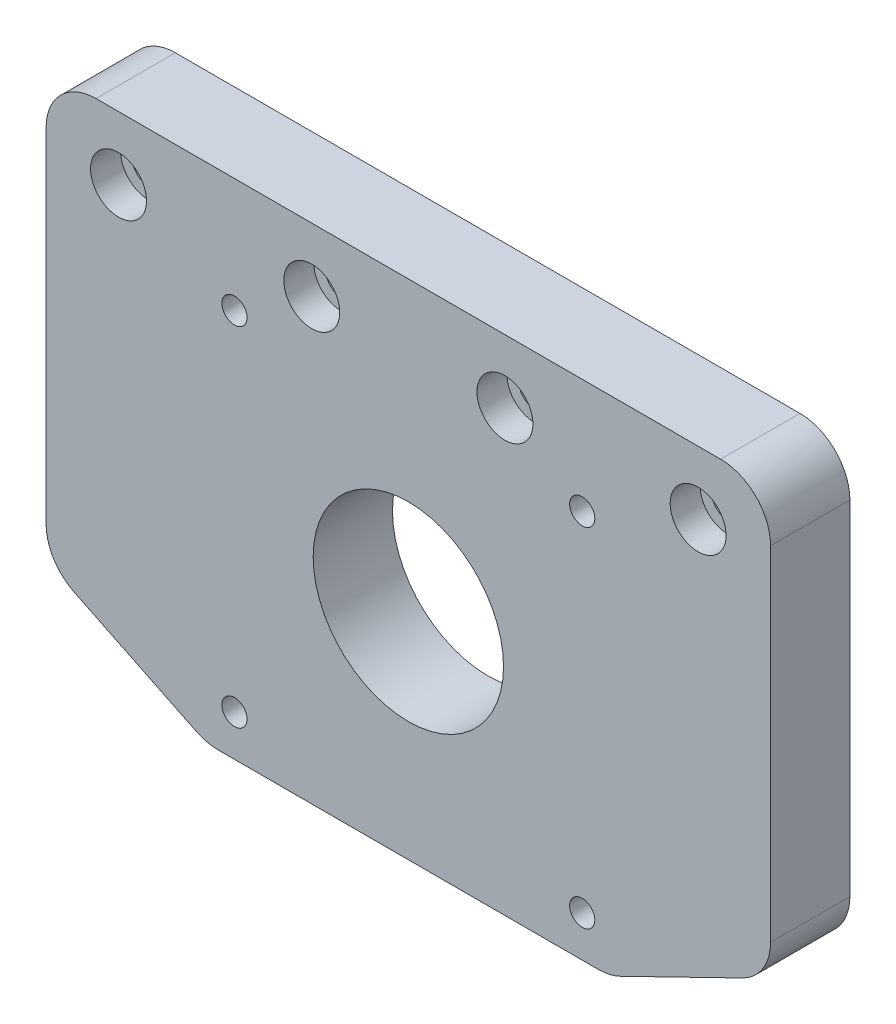
ISO-10303-21;
HEADER;
FILE_DESCRIPTION(('STEP AP214'),'2;1');
FILE_NAME('part.step','',(''),(''),'','','');
FILE_SCHEMA(('AUTOMOTIVE_DESIGN { 1 0 10303 214 1 1 1 1 }'));
ENDSEC;
DATA;
#1=APPLICATION_CONTEXT('core data for automotive mechanical design processes');
#2=APPLICATION_PROTOCOL_DEFINITION('international standard','automotive_design',2000,#1);
#3=PRODUCT_CONTEXT('',#1,'mechanical');
#4=PRODUCT('Part','Part','',(#3));
#5=PRODUCT_RELATED_PRODUCT_CATEGORY('part','',(#4));
#6=PRODUCT_DEFINITION_FORMATION('','',#4);
#7=PRODUCT_DEFINITION_CONTEXT('part definition',#1,'design');
#8=PRODUCT_DEFINITION('design','',#6,#7);
#9=PRODUCT_DEFINITION_SHAPE('','',#8);
#10=(LENGTH_UNIT() NAMED_UNIT(*) SI_UNIT(.MILLI.,.METRE.));
#11=(NAMED_UNIT(*) PLANE_ANGLE_UNIT() SI_UNIT($,.RADIAN.));
#12=(NAMED_UNIT(*) SI_UNIT($,.STERADIAN.) SOLID_ANGLE_UNIT());
#13=UNCERTAINTY_MEASURE_WITH_UNIT(LENGTH_MEASURE(1.E-05),#10,'distance_accuracy_value','');
#14=(GEOMETRIC_REPRESENTATION_CONTEXT(3) GLOBAL_UNCERTAINTY_ASSIGNED_CONTEXT((#13)) GLOBAL_UNIT_ASSIGNED_CONTEXT((#10,
#11,#12)) REPRESENTATION_CONTEXT('',''));
#15=CARTESIAN_POINT('',(0.,0.,0.));
#16=DIRECTION('',(0.,0.,1.));
#17=DIRECTION('',(1.,0.,0.));
#18=AXIS2_PLACEMENT_3D('',#15,#16,#17);
#19=CARTESIAN_POINT('',(-221.389376145797,34.3266028726113,15.875));
#20=DIRECTION('',(0.,0.,1.));
#21=DIRECTION('',(1.,0.,0.));
#22=AXIS2_PLACEMENT_3D('',#19,#20,#21);
#23=PLANE('',#22);
#24=CARTESIAN_POINT('',(-221.389376145797,26.9851028726113,15.875));
#25=DIRECTION('',(0.,0.,-1.));
#26=DIRECTION('',(-1.,0.,0.));
#27=AXIS2_PLACEMENT_3D('',#24,#25,#26);
#28=CIRCLE('',#27,19.05);
#29=CARTESIAN_POINT('',(-202.339376145797,26.9851028726113,15.875));
#30=VERTEX_POINT('',#29);
#31=EDGE_CURVE('E425',#30,#30,#28,.T.);
#32=ORIENTED_EDGE('',*,*,#31,.T.);
#33=EDGE_LOOP('',(#32));
#34=FACE_BOUND('',#33,.T.);
#35=CARTESIAN_POINT('',(-256.189376145797,-7.81489712738868,15.875));
#36=DIRECTION('',(0.,0.,-1.));
#37=DIRECTION('',(1.,0.,0.));
#38=AXIS2_PLACEMENT_3D('',#35,#36,#37);
#39=CIRCLE('',#38,2.5175);
#40=CARTESIAN_POINT('',(-258.706876145797,-7.81489712738868,15.875));
#41=VERTEX_POINT('',#40);
#42=EDGE_CURVE('E416',#41,#41,#39,.T.);
#43=ORIENTED_EDGE('',*,*,#42,.T.);
#44=EDGE_LOOP('',(#43));
#45=FACE_BOUND('',#44,.T.);
#46=CARTESIAN_POINT('',(-186.589376145797,61.7851028726113,15.875));
#47=DIRECTION('',(0.,0.,-1.));
#48=DIRECTION('',(1.,0.,0.));
#49=AXIS2_PLACEMENT_3D('',#46,#47,#48);
#50=CIRCLE('',#49,2.5175);
#51=CARTESIAN_POINT('',(-189.106876145797,61.7851028726113,15.875));
#52=VERTEX_POINT('',#51);
#53=EDGE_CURVE('E207',#52,#52,#50,.T.);
#54=ORIENTED_EDGE('',*,*,#53,.T.);
#55=EDGE_LOOP('',(#54));
#56=FACE_BOUND('',#55,.T.);
#57=CARTESIAN_POINT('',(-256.189376145797,61.7851028726113,15.875));
#58=DIRECTION('',(0.,0.,-1.));
#59=DIRECTION('',(1.,0.,0.));
#60=AXIS2_PLACEMENT_3D('',#57,#58,#59);
#61=CIRCLE('',#60,2.5175);
#62=CARTESIAN_POINT('',(-258.706876145797,61.7851028726113,15.875));
#63=VERTEX_POINT('',#62);
#64=EDGE_CURVE('E202',#63,#63,#61,.T.);
#65=ORIENTED_EDGE('',*,*,#64,.T.);
#66=EDGE_LOOP('',(#65));
#67=FACE_BOUND('',#66,.T.);
#68=CARTESIAN_POINT('',(-186.589376145797,-7.81489712738868,15.875));
#69=DIRECTION('',(0.,0.,-1.));
#70=DIRECTION('',(1.,0.,0.));
#71=AXIS2_PLACEMENT_3D('',#68,#69,#70);
#72=CIRCLE('',#71,2.5175);
#73=CARTESIAN_POINT('',(-189.106876145797,-7.81489712738868,15.875));
#74=VERTEX_POINT('',#73);
#75=EDGE_CURVE('E219',#74,#74,#72,.T.);
#76=ORIENTED_EDGE('',*,*,#75,.T.);
#77=EDGE_LOOP('',(#76));
#78=FACE_BOUND('',#77,.T.);
#79=CARTESIAN_POINT('',(-163.389376145797,71.9681028726113,15.875));
#80=DIRECTION('',(0.,0.,-1.));
#81=DIRECTION('',(1.,0.,0.));
#82=AXIS2_PLACEMENT_3D('',#79,#80,#81);
#83=CIRCLE('',#82,5.6);
#84=CARTESIAN_POINT('',(-168.989376145797,71.9681028726113,15.875));
#85=VERTEX_POINT('',#84);
#86=EDGE_CURVE('E257',#85,#85,#83,.T.);
#87=ORIENTED_EDGE('',*,*,#86,.T.);
#88=EDGE_LOOP('',(#87));
#89=FACE_BOUND('',#88,.T.);
#90=CARTESIAN_POINT('',(-202.056042812464,71.9681028726113,15.875));
#91=DIRECTION('',(0.,0.,-1.));
#92=DIRECTION('',(1.,0.,0.));
#93=AXIS2_PLACEMENT_3D('',#90,#91,#92);
#94=CIRCLE('',#93,5.6);
#95=CARTESIAN_POINT('',(-207.656042812464,71.9681028726113,15.875));
#96=VERTEX_POINT('',#95);
#97=EDGE_CURVE('E240',#96,#96,#94,.T.);
#98=ORIENTED_EDGE('',*,*,#97,.T.);
#99=EDGE_LOOP('',(#98));
#100=FACE_BOUND('',#99,.T.);
#101=CARTESIAN_POINT('',(-240.72270947913,71.9681028726113,15.875));
#102=DIRECTION('',(0.,0.,-1.));
#103=DIRECTION('',(1.,0.,0.));
#104=AXIS2_PLACEMENT_3D('',#101,#102,#103);
#105=CIRCLE('',#104,5.6);
#106=CARTESIAN_POINT('',(-246.32270947913,71.9681028726113,15.875));
#107=VERTEX_POINT('',#106);
#108=EDGE_CURVE('E523',#107,#107,#105,.T.);
#109=ORIENTED_EDGE('',*,*,#108,.T.);
#110=EDGE_LOOP('',(#109));
#111=FACE_BOUND('',#110,.T.);
#112=CARTESIAN_POINT('',(-279.389376145797,71.9681028726113,15.875));
#113=DIRECTION('',(0.,0.,-1.));
#114=DIRECTION('',(1.,0.,0.));
#115=AXIS2_PLACEMENT_3D('',#112,#113,#114);
#116=CIRCLE('',#115,5.6);
#117=CARTESIAN_POINT('',(-284.989376145797,71.9681028726113,15.875));
#118=VERTEX_POINT('',#117);
#119=EDGE_CURVE('E527',#118,#118,#116,.T.);
#120=ORIENTED_EDGE('',*,*,#119,.T.);
#121=EDGE_LOOP('',(#120));
#122=FACE_BOUND('',#121,.T.);
#123=CARTESIAN_POINT('',(-283.889376145797,5.91685384979715,15.875));
#124=DIRECTION('',(0.,0.,-1.));
#125=DIRECTION('',(-0.848045906367809,-0.529922768611428,0.));
#126=AXIS2_PLACEMENT_3D('',#123,#124,#125);
#127=CIRCLE('',#126,10.);
#128=CARTESIAN_POINT('',(-288.273013331941,-3.0711228424432,15.875));
#129=VERTEX_POINT('',#128);
#130=CARTESIAN_POINT('',(-293.889376145797,5.91685384979715,15.875));
#131=VERTEX_POINT('',#130);
#132=EDGE_CURVE('E274',#129,#131,#127,.T.);
#133=ORIENTED_EDGE('',*,*,#132,.F.);
#134=DIRECTION('',(0.898797669224035,-0.438363718614397,0.));
#135=VECTOR('',#134,1.);
#136=CARTESIAN_POINT('',(-261.733786511246,-16.0148971273887,15.875));
#137=LINE('',#136,#135);
#138=CARTESIAN_POINT('',(-263.808785311534,-15.002873819629,15.875));
#139=VERTEX_POINT('',#138);
#140=EDGE_CURVE('E241',#129,#139,#137,.T.);
#141=ORIENTED_EDGE('',*,*,#140,.T.);
#142=CARTESIAN_POINT('',(-259.42514812539,-6.01489712738867,15.875));
#143=DIRECTION('',(0.,0.,-1.));
#144=DIRECTION('',(-0.224947027959879,-0.97437099434046,0.));
#145=AXIS2_PLACEMENT_3D('',#142,#143,#144);
#146=CIRCLE('',#145,10.);
#147=CARTESIAN_POINT('',(-259.42514812539,-16.0148971273887,15.875));
#148=VERTEX_POINT('',#147);
#149=EDGE_CURVE('E374',#148,#139,#146,.T.);
#150=ORIENTED_EDGE('',*,*,#149,.F.);
#151=DIRECTION('',(1.,0.,0.));
#152=VECTOR('',#151,1.);
#153=CARTESIAN_POINT('',(-220.113786511246,-16.0148971273887,15.875));
#154=LINE('',#153,#152);
#155=CARTESIAN_POINT('',(-183.353604166204,-16.0148971273887,15.875));
#156=VERTEX_POINT('',#155);
#157=EDGE_CURVE('E384',#148,#156,#154,.T.);
#158=ORIENTED_EDGE('',*,*,#157,.T.);
#159=CARTESIAN_POINT('',(-183.353604166204,-6.01489712738867,15.875));
#160=DIRECTION('',(0.,0.,-1.));
#161=DIRECTION('',(0.224947027959879,-0.97437099434046,0.));
#162=AXIS2_PLACEMENT_3D('',#159,#160,#161);
#163=CIRCLE('',#162,10.);
#164=CARTESIAN_POINT('',(-178.96996698006,-15.002873819629,15.875));
#165=VERTEX_POINT('',#164);
#166=EDGE_CURVE('E309',#165,#156,#163,.T.);
#167=ORIENTED_EDGE('',*,*,#166,.F.);
#168=DIRECTION('',(0.898797669224035,0.438363718614397,0.));
#169=VECTOR('',#168,1.);
#170=CARTESIAN_POINT('',(-181.044965780348,-16.0148971273887,15.875));
#171=LINE('',#170,#169);
#172=CARTESIAN_POINT('',(-154.505738959653,-3.0711228424432,15.875));
#173=VERTEX_POINT('',#172);
#174=EDGE_CURVE('E394',#165,#173,#171,.T.);
#175=ORIENTED_EDGE('',*,*,#174,.T.);
#176=CARTESIAN_POINT('',(-158.889376145797,5.91685384979716,15.875));
#177=DIRECTION('',(0.,0.,-1.));
#178=DIRECTION('',(0.848045906367809,-0.529922768611429,0.));
#179=AXIS2_PLACEMENT_3D('',#176,#177,#178);
#180=CIRCLE('',#179,10.);
#181=CARTESIAN_POINT('',(-148.889376145797,5.91685384979716,15.875));
#182=VERTEX_POINT('',#181);
#183=EDGE_CURVE('E400',#182,#173,#180,.T.);
#184=ORIENTED_EDGE('',*,*,#183,.F.);
#185=DIRECTION('',(0.,1.,0.));
#186=VECTOR('',#185,1.);
#187=CARTESIAN_POINT('',(-148.889376145797,-0.331897127388672,15.875));
#188=LINE('',#187,#186);
#189=CARTESIAN_POINT('',(-148.889376145797,74.6681028726113,15.875));
#190=VERTEX_POINT('',#189);
#191=EDGE_CURVE('E327',#182,#190,#188,.T.);
#192=ORIENTED_EDGE('',*,*,#191,.T.);
#193=CARTESIAN_POINT('',(-158.889376145797,74.6681028726113,15.875));
#194=DIRECTION('',(0.,0.,-1.));
#195=DIRECTION('',(0.707106781186548,0.707106781186548,0.));
#196=AXIS2_PLACEMENT_3D('',#193,#194,#195);
#197=CIRCLE('',#196,10.);
#198=CARTESIAN_POINT('',(-158.889376145797,84.6681028726113,15.875));
#199=VERTEX_POINT('',#198);
#200=EDGE_CURVE('E403',#199,#190,#197,.T.);
#201=ORIENTED_EDGE('',*,*,#200,.F.);
#202=DIRECTION('',(-1.,0.,0.));
#203=VECTOR('',#202,1.);
#204=CARTESIAN_POINT('',(-148.889376145797,84.6681028726113,15.875));
#205=LINE('',#204,#203);
#206=CARTESIAN_POINT('',(-283.889376145797,84.6681028726113,15.875));
#207=VERTEX_POINT('',#206);
#208=EDGE_CURVE('E347',#199,#207,#205,.T.);
#209=ORIENTED_EDGE('',*,*,#208,.T.);
#210=CARTESIAN_POINT('',(-283.889376145797,74.6681028726113,15.875));
#211=DIRECTION('',(0.,0.,-1.));
#212=DIRECTION('',(-0.707106781186548,0.707106781186548,0.));
#213=AXIS2_PLACEMENT_3D('',#210,#211,#212);
#214=CIRCLE('',#213,10.);
#215=CARTESIAN_POINT('',(-293.889376145797,74.6681028726113,15.875));
#216=VERTEX_POINT('',#215);
#217=EDGE_CURVE('E352',#216,#207,#214,.T.);
#218=ORIENTED_EDGE('',*,*,#217,.F.);
#219=DIRECTION('',(0.,-1.,0.));
#220=VECTOR('',#219,1.);
#221=CARTESIAN_POINT('',(-293.889376145797,84.6681028726113,15.875));
#222=LINE('',#221,#220);
#223=EDGE_CURVE('E11',#216,#131,#222,.T.);
#224=ORIENTED_EDGE('',*,*,#223,.T.);
#225=EDGE_LOOP('',(#133,#141,#150,#158,#167,#175,#184,#192,#201,#209,#218,#224));
#226=FACE_BOUND('',#225,.T.);
#227=ADVANCED_FACE('F17',(#34,#45,#56,#67,#78,#89,#100,#111,#122,#226),#23,.T.);
#228=CARTESIAN_POINT('',(-293.889376145797,84.6681028726113,0.));
#229=DIRECTION('',(-1.,0.,0.));
#230=DIRECTION('',(0.,0.,1.));
#231=AXIS2_PLACEMENT_3D('',#228,#229,#230);
#232=PLANE('',#231);
#233=DIRECTION('',(0.,0.,-1.));
#234=VECTOR('',#233,1.);
#235=CARTESIAN_POINT('',(-293.889376145797,5.91685384979715,0.));
#236=LINE('',#235,#234);
#237=CARTESIAN_POINT('',(-293.889376145797,5.91685384979715,0.));
#238=VERTEX_POINT('',#237);
#239=EDGE_CURVE('E276',#131,#238,#236,.T.);
#240=ORIENTED_EDGE('',*,*,#239,.F.);
#241=ORIENTED_EDGE('',*,*,#223,.F.);
#242=DIRECTION('',(0.,0.,1.));
#243=VECTOR('',#242,1.);
#244=CARTESIAN_POINT('',(-293.889376145797,74.6681028726113,0.));
#245=LINE('',#244,#243);
#246=CARTESIAN_POINT('',(-293.889376145797,74.6681028726113,0.));
#247=VERTEX_POINT('',#246);
#248=EDGE_CURVE('E415',#247,#216,#245,.T.);
#249=ORIENTED_EDGE('',*,*,#248,.F.);
#250=DIRECTION('',(0.,-1.,0.));
#251=VECTOR('',#250,1.);
#252=CARTESIAN_POINT('',(-293.889376145797,84.6681028726113,0.));
#253=LINE('',#252,#251);
#254=EDGE_CURVE('E236',#247,#238,#253,.T.);
#255=ORIENTED_EDGE('',*,*,#254,.T.);
#256=EDGE_LOOP('',(#240,#241,#249,#255));
#257=FACE_BOUND('',#256,.T.);
#258=ADVANCED_FACE('F452',(#257),#232,.T.);
#259=CARTESIAN_POINT('',(-221.389376145797,26.9851028726113,15.875));
#260=DIRECTION('',(0.,0.,-1.));
#261=DIRECTION('',(-1.,0.,0.));
#262=AXIS2_PLACEMENT_3D('',#259,#260,#261);
#263=CYLINDRICAL_SURFACE('',#262,19.05);
#264=ORIENTED_EDGE('',*,*,#31,.F.);
#265=DIRECTION('',(0.,0.,-1.));
#266=VECTOR('',#265,1.);
#267=CARTESIAN_POINT('',(-202.339376145797,26.9851028726113,15.875));
#268=LINE('',#267,#266);
#269=CARTESIAN_POINT('',(-202.339376145797,26.9851028726113,0.));
#270=VERTEX_POINT('',#269);
#271=EDGE_CURVE('E20',#30,#270,#268,.T.);
#272=ORIENTED_EDGE('',*,*,#271,.T.);
#273=CARTESIAN_POINT('',(-221.389376145797,26.9851028726113,0.));
#274=DIRECTION('',(0.,0.,1.));
#275=DIRECTION('',(-1.,0.,0.));
#276=AXIS2_PLACEMENT_3D('',#273,#274,#275);
#277=CIRCLE('',#276,19.05);
#278=EDGE_CURVE('E371',#270,#270,#277,.T.);
#279=ORIENTED_EDGE('',*,*,#278,.F.);
#280=ORIENTED_EDGE('',*,*,#271,.F.);
#281=EDGE_LOOP('',(#264,#272,#279,#280));
#282=FACE_BOUND('',#281,.T.);
#283=ADVANCED_FACE('F429',(#282),#263,.F.);
#284=CARTESIAN_POINT('',(-256.189376145797,-7.81489712738868,7.14375));
#285=DIRECTION('',(0.,0.,-1.));
#286=DIRECTION('',(1.,0.,0.));
#287=AXIS2_PLACEMENT_3D('',#284,#285,#286);
#288=CYLINDRICAL_SURFACE('',#287,2.5175);
#289=ORIENTED_EDGE('',*,*,#42,.F.);
#290=DIRECTION('',(0.,0.,-1.));
#291=VECTOR('',#290,1.);
#292=CARTESIAN_POINT('',(-258.706876145797,-7.81489712738868,7.14375));
#293=LINE('',#292,#291);
#294=CARTESIAN_POINT('',(-258.706876145797,-7.81489712738868,0.));
#295=VERTEX_POINT('',#294);
#296=EDGE_CURVE('E49',#41,#295,#293,.T.);
#297=ORIENTED_EDGE('',*,*,#296,.T.);
#298=CARTESIAN_POINT('',(-256.189376145797,-7.81489712738868,0.));
#299=DIRECTION('',(0.,0.,1.));
#300=DIRECTION('',(1.,0.,0.));
#301=AXIS2_PLACEMENT_3D('',#298,#299,#300);
#302=CIRCLE('',#301,2.5175);
#303=EDGE_CURVE('E370',#295,#295,#302,.T.);
#304=ORIENTED_EDGE('',*,*,#303,.F.);
#305=ORIENTED_EDGE('',*,*,#296,.F.);
#306=EDGE_LOOP('',(#289,#297,#304,#305));
#307=FACE_BOUND('',#306,.T.);
#308=ADVANCED_FACE('F1053',(#307),#288,.F.);
#309=CARTESIAN_POINT('',(-186.589376145797,61.7851028726113,7.14375));
#310=DIRECTION('',(0.,0.,-1.));
#311=DIRECTION('',(1.,0.,0.));
#312=AXIS2_PLACEMENT_3D('',#309,#310,#311);
#313=CYLINDRICAL_SURFACE('',#312,2.5175);
#314=ORIENTED_EDGE('',*,*,#53,.F.);
#315=DIRECTION('',(0.,0.,-1.));
#316=VECTOR('',#315,1.);
#317=CARTESIAN_POINT('',(-189.106876145797,61.7851028726113,7.14375));
#318=LINE('',#317,#316);
#319=CARTESIAN_POINT('',(-189.106876145797,61.7851028726113,0.));
#320=VERTEX_POINT('',#319);
#321=EDGE_CURVE('E284',#52,#320,#318,.T.);
#322=ORIENTED_EDGE('',*,*,#321,.T.);
#323=CARTESIAN_POINT('',(-186.589376145797,61.7851028726113,0.));
#324=DIRECTION('',(0.,0.,1.));
#325=DIRECTION('',(1.,0.,0.));
#326=AXIS2_PLACEMENT_3D('',#323,#324,#325);
#327=CIRCLE('',#326,2.5175);
#328=EDGE_CURVE('E361',#320,#320,#327,.T.);
#329=ORIENTED_EDGE('',*,*,#328,.F.);
#330=ORIENTED_EDGE('',*,*,#321,.F.);
#331=EDGE_LOOP('',(#314,#322,#329,#330));
#332=FACE_BOUND('',#331,.T.);
#333=ADVANCED_FACE('F1047',(#332),#313,.F.);
#334=CARTESIAN_POINT('',(-256.189376145797,61.7851028726113,7.14375));
#335=DIRECTION('',(0.,0.,-1.));
#336=DIRECTION('',(1.,0.,0.));
#337=AXIS2_PLACEMENT_3D('',#334,#335,#336);
#338=CYLINDRICAL_SURFACE('',#337,2.5175);
#339=ORIENTED_EDGE('',*,*,#64,.F.);
#340=DIRECTION('',(0.,0.,-1.));
#341=VECTOR('',#340,1.);
#342=CARTESIAN_POINT('',(-258.706876145797,61.7851028726113,7.14375));
#343=LINE('',#342,#341);
#344=CARTESIAN_POINT('',(-258.706876145797,61.7851028726113,0.));
#345=VERTEX_POINT('',#344);
#346=EDGE_CURVE('E205',#63,#345,#343,.T.);
#347=ORIENTED_EDGE('',*,*,#346,.T.);
#348=CARTESIAN_POINT('',(-256.189376145797,61.7851028726113,0.));
#349=DIRECTION('',(0.,0.,1.));
#350=DIRECTION('',(1.,0.,0.));
#351=AXIS2_PLACEMENT_3D('',#348,#349,#350);
#352=CIRCLE('',#351,2.5175);
#353=EDGE_CURVE('E210',#345,#345,#352,.T.);
#354=ORIENTED_EDGE('',*,*,#353,.F.);
#355=ORIENTED_EDGE('',*,*,#346,.F.);
#356=EDGE_LOOP('',(#339,#347,#354,#355));
#357=FACE_BOUND('',#356,.T.);
#358=ADVANCED_FACE('F204',(#357),#338,.F.);
#359=CARTESIAN_POINT('',(-186.589376145797,-7.81489712738868,7.14375));
#360=DIRECTION('',(0.,0.,-1.));
#361=DIRECTION('',(1.,0.,0.));
#362=AXIS2_PLACEMENT_3D('',#359,#360,#361);
#363=CYLINDRICAL_SURFACE('',#362,2.5175);
#364=ORIENTED_EDGE('',*,*,#75,.F.);
#365=DIRECTION('',(0.,0.,-1.));
#366=VECTOR('',#365,1.);
#367=CARTESIAN_POINT('',(-189.106876145797,-7.81489712738868,7.14375));
#368=LINE('',#367,#366);
#369=CARTESIAN_POINT('',(-189.106876145797,-7.81489712738868,0.));
#370=VERTEX_POINT('',#369);
#371=EDGE_CURVE('E212',#74,#370,#368,.T.);
#372=ORIENTED_EDGE('',*,*,#371,.T.);
#373=CARTESIAN_POINT('',(-186.589376145797,-7.81489712738868,0.));
#374=DIRECTION('',(0.,0.,1.));
#375=DIRECTION('',(1.,0.,0.));
#376=AXIS2_PLACEMENT_3D('',#373,#374,#375);
#377=CIRCLE('',#376,2.5175);
#378=EDGE_CURVE('E296',#370,#370,#377,.T.);
#379=ORIENTED_EDGE('',*,*,#378,.F.);
#380=ORIENTED_EDGE('',*,*,#371,.F.);
#381=EDGE_LOOP('',(#364,#372,#379,#380));
#382=FACE_BOUND('',#381,.T.);
#383=ADVANCED_FACE('F1027',(#382),#363,.F.);
#384=CARTESIAN_POINT('',(-283.889376145797,74.6681028726113,0.));
#385=DIRECTION('',(0.,0.,1.));
#386=DIRECTION('',(-0.707106781186548,0.707106781186548,0.));
#387=AXIS2_PLACEMENT_3D('',#384,#385,#386);
#388=CYLINDRICAL_SURFACE('',#387,10.);
#389=ORIENTED_EDGE('',*,*,#217,.T.);
#390=DIRECTION('',(0.,0.,-1.));
#391=VECTOR('',#390,1.);
#392=CARTESIAN_POINT('',(-283.889376145797,84.6681028726113,0.));
#393=LINE('',#392,#391);
#394=CARTESIAN_POINT('',(-283.889376145797,84.6681028726113,0.));
#395=VERTEX_POINT('',#394);
#396=EDGE_CURVE('E353',#207,#395,#393,.T.);
#397=ORIENTED_EDGE('',*,*,#396,.T.);
#398=CARTESIAN_POINT('',(-283.889376145797,74.6681028726113,0.));
#399=DIRECTION('',(0.,0.,1.));
#400=DIRECTION('',(-0.707106781186548,0.707106781186548,0.));
#401=AXIS2_PLACEMENT_3D('',#398,#399,#400);
#402=CIRCLE('',#401,10.);
#403=EDGE_CURVE('E239',#395,#247,#402,.T.);
#404=ORIENTED_EDGE('',*,*,#403,.T.);
#405=ORIENTED_EDGE('',*,*,#248,.T.);
#406=EDGE_LOOP('',(#389,#397,#404,#405));
#407=FACE_BOUND('',#406,.T.);
#408=ADVANCED_FACE('F456',(#407),#388,.T.);
#409=CARTESIAN_POINT('',(-148.889376145797,84.6681028726113,0.));
#410=DIRECTION('',(0.,1.,0.));
#411=DIRECTION('',(1.,0.,0.));
#412=AXIS2_PLACEMENT_3D('',#409,#410,#411);
#413=PLANE('',#412);
#414=DIRECTION('',(0.,0.,1.));
#415=VECTOR('',#414,1.);
#416=CARTESIAN_POINT('',(-158.889376145797,84.6681028726113,0.));
#417=LINE('',#416,#415);
#418=CARTESIAN_POINT('',(-158.889376145797,84.6681028726113,0.));
#419=VERTEX_POINT('',#418);
#420=EDGE_CURVE('E406',#419,#199,#417,.T.);
#421=ORIENTED_EDGE('',*,*,#420,.F.);
#422=DIRECTION('',(-1.,0.,0.));
#423=VECTOR('',#422,1.);
#424=CARTESIAN_POINT('',(-148.889376145797,84.6681028726113,0.));
#425=LINE('',#424,#423);
#426=EDGE_CURVE('E319',#419,#395,#425,.T.);
#427=ORIENTED_EDGE('',*,*,#426,.T.);
#428=ORIENTED_EDGE('',*,*,#396,.F.);
#429=ORIENTED_EDGE('',*,*,#208,.F.);
#430=EDGE_LOOP('',(#421,#427,#428,#429));
#431=FACE_BOUND('',#430,.T.);
#432=ADVANCED_FACE('F462',(#431),#413,.T.);
#433=CARTESIAN_POINT('',(-158.889376145797,74.6681028726113,0.));
#434=DIRECTION('',(0.,0.,1.));
#435=DIRECTION('',(0.707106781186548,0.707106781186548,0.));
#436=AXIS2_PLACEMENT_3D('',#433,#434,#435);
#437=CYLINDRICAL_SURFACE('',#436,10.);
#438=ORIENTED_EDGE('',*,*,#200,.T.);
#439=DIRECTION('',(0.,0.,-1.));
#440=VECTOR('',#439,1.);
#441=CARTESIAN_POINT('',(-148.889376145797,74.6681028726113,0.));
#442=LINE('',#441,#440);
#443=CARTESIAN_POINT('',(-148.889376145797,74.6681028726113,0.));
#444=VERTEX_POINT('',#443);
#445=EDGE_CURVE('E324',#190,#444,#442,.T.);
#446=ORIENTED_EDGE('',*,*,#445,.T.);
#447=CARTESIAN_POINT('',(-158.889376145797,74.6681028726113,0.));
#448=DIRECTION('',(0.,0.,1.));
#449=DIRECTION('',(0.707106781186548,0.707106781186548,0.));
#450=AXIS2_PLACEMENT_3D('',#447,#448,#449);
#451=CIRCLE('',#450,10.);
#452=EDGE_CURVE('E322',#444,#419,#451,.T.);
#453=ORIENTED_EDGE('',*,*,#452,.T.);
#454=ORIENTED_EDGE('',*,*,#420,.T.);
#455=EDGE_LOOP('',(#438,#446,#453,#454));
#456=FACE_BOUND('',#455,.T.);
#457=ADVANCED_FACE('F466',(#456),#437,.T.);
#458=CARTESIAN_POINT('',(-148.889376145797,-0.331897127388672,0.));
#459=DIRECTION('',(1.,0.,0.));
#460=DIRECTION('',(0.,1.,0.));
#461=AXIS2_PLACEMENT_3D('',#458,#459,#460);
#462=PLANE('',#461);
#463=DIRECTION('',(0.,0.,1.));
#464=VECTOR('',#463,1.);
#465=CARTESIAN_POINT('',(-148.889376145797,5.91685384979716,0.));
#466=LINE('',#465,#464);
#467=CARTESIAN_POINT('',(-148.889376145797,5.91685384979716,0.));
#468=VERTEX_POINT('',#467);
#469=EDGE_CURVE('E328',#468,#182,#466,.T.);
#470=ORIENTED_EDGE('',*,*,#469,.F.);
#471=DIRECTION('',(0.,1.,0.));
#472=VECTOR('',#471,1.);
#473=CARTESIAN_POINT('',(-148.889376145797,-0.331897127388672,0.));
#474=LINE('',#473,#472);
#475=EDGE_CURVE('E334',#468,#444,#474,.T.);
#476=ORIENTED_EDGE('',*,*,#475,.T.);
#477=ORIENTED_EDGE('',*,*,#445,.F.);
#478=ORIENTED_EDGE('',*,*,#191,.F.);
#479=EDGE_LOOP('',(#470,#476,#477,#478));
#480=FACE_BOUND('',#479,.T.);
#481=ADVANCED_FACE('F473',(#480),#462,.T.);
#482=CARTESIAN_POINT('',(-158.889376145797,5.91685384979716,0.));
#483=DIRECTION('',(0.,0.,1.));
#484=DIRECTION('',(0.848045906367809,-0.529922768611429,0.));
#485=AXIS2_PLACEMENT_3D('',#482,#483,#484);
#486=CYLINDRICAL_SURFACE('',#485,10.);
#487=ORIENTED_EDGE('',*,*,#183,.T.);
#488=DIRECTION('',(0.,0.,-1.));
#489=VECTOR('',#488,1.);
#490=CARTESIAN_POINT('',(-154.505738959653,-3.0711228424432,0.));
#491=LINE('',#490,#489);
#492=CARTESIAN_POINT('',(-154.505738959653,-3.0711228424432,0.));
#493=VERTEX_POINT('',#492);
#494=EDGE_CURVE('E310',#173,#493,#491,.T.);
#495=ORIENTED_EDGE('',*,*,#494,.T.);
#496=CARTESIAN_POINT('',(-158.889376145797,5.91685384979716,0.));
#497=DIRECTION('',(0.,0.,1.));
#498=DIRECTION('',(0.848045906367809,-0.529922768611429,0.));
#499=AXIS2_PLACEMENT_3D('',#496,#497,#498);
#500=CIRCLE('',#499,10.);
#501=EDGE_CURVE('E337',#493,#468,#500,.T.);
#502=ORIENTED_EDGE('',*,*,#501,.T.);
#503=ORIENTED_EDGE('',*,*,#469,.T.);
#504=EDGE_LOOP('',(#487,#495,#502,#503));
#505=FACE_BOUND('',#504,.T.);
#506=ADVANCED_FACE('F995',(#505),#486,.T.);
#507=CARTESIAN_POINT('',(-181.044965780348,-16.0148971273887,0.));
#508=DIRECTION('',(0.438363718614397,-0.898797669224035,0.));
#509=DIRECTION('',(0.,0.,-1.));
#510=AXIS2_PLACEMENT_3D('',#507,#508,#509);
#511=PLANE('',#510);
#512=DIRECTION('',(0.,0.,1.));
#513=VECTOR('',#512,1.);
#514=CARTESIAN_POINT('',(-178.96996698006,-15.002873819629,0.));
#515=LINE('',#514,#513);
#516=CARTESIAN_POINT('',(-178.96996698006,-15.002873819629,0.));
#517=VERTEX_POINT('',#516);
#518=EDGE_CURVE('E304',#517,#165,#515,.T.);
#519=ORIENTED_EDGE('',*,*,#518,.F.);
#520=DIRECTION('',(0.898797669224035,0.438363718614397,0.));
#521=VECTOR('',#520,1.);
#522=CARTESIAN_POINT('',(-181.044965780348,-16.0148971273887,0.));
#523=LINE('',#522,#521);
#524=EDGE_CURVE('E341',#517,#493,#523,.T.);
#525=ORIENTED_EDGE('',*,*,#524,.T.);
#526=ORIENTED_EDGE('',*,*,#494,.F.);
#527=ORIENTED_EDGE('',*,*,#174,.F.);
#528=EDGE_LOOP('',(#519,#525,#526,#527));
#529=FACE_BOUND('',#528,.T.);
#530=ADVANCED_FACE('F976',(#529),#511,.T.);
#531=CARTESIAN_POINT('',(-183.353604166204,-6.01489712738867,0.));
#532=DIRECTION('',(0.,0.,1.));
#533=DIRECTION('',(0.224947027959879,-0.97437099434046,0.));
#534=AXIS2_PLACEMENT_3D('',#531,#532,#533);
#535=CYLINDRICAL_SURFACE('',#534,10.);
#536=ORIENTED_EDGE('',*,*,#166,.T.);
#537=DIRECTION('',(0.,0.,-1.));
#538=VECTOR('',#537,1.);
#539=CARTESIAN_POINT('',(-183.353604166204,-16.0148971273887,0.));
#540=LINE('',#539,#538);
#541=CARTESIAN_POINT('',(-183.353604166204,-16.0148971273887,0.));
#542=VERTEX_POINT('',#541);
#543=EDGE_CURVE('E385',#156,#542,#540,.T.);
#544=ORIENTED_EDGE('',*,*,#543,.T.);
#545=CARTESIAN_POINT('',(-183.353604166204,-6.01489712738867,0.));
#546=DIRECTION('',(0.,0.,1.));
#547=DIRECTION('',(0.224947027959879,-0.97437099434046,0.));
#548=AXIS2_PLACEMENT_3D('',#545,#546,#547);
#549=CIRCLE('',#548,10.);
#550=EDGE_CURVE('E344',#542,#517,#549,.T.);
#551=ORIENTED_EDGE('',*,*,#550,.T.);
#552=ORIENTED_EDGE('',*,*,#518,.T.);
#553=EDGE_LOOP('',(#536,#544,#551,#552));
#554=FACE_BOUND('',#553,.T.);
#555=ADVANCED_FACE('F973',(#554),#535,.T.);
#556=CARTESIAN_POINT('',(-261.733786511246,-16.0148971273887,0.));
#557=DIRECTION('',(0.,-1.,0.));
#558=DIRECTION('',(0.,0.,-1.));
#559=AXIS2_PLACEMENT_3D('',#556,#557,#558);
#560=PLANE('',#559);
#561=DIRECTION('',(0.,0.,1.));
#562=VECTOR('',#561,1.);
#563=CARTESIAN_POINT('',(-259.42514812539,-16.0148971273887,0.));
#564=LINE('',#563,#562);
#565=CARTESIAN_POINT('',(-259.42514812539,-16.0148971273887,0.));
#566=VERTEX_POINT('',#565);
#567=EDGE_CURVE('E378',#566,#148,#564,.T.);
#568=ORIENTED_EDGE('',*,*,#567,.F.);
#569=DIRECTION('',(-1.,0.,0.));
#570=VECTOR('',#569,1.);
#571=CARTESIAN_POINT('',(-220.113786511246,-16.0148971273887,0.));
#572=LINE('',#571,#570);
#573=EDGE_CURVE('E300',#542,#566,#572,.T.);
#574=ORIENTED_EDGE('',*,*,#573,.F.);
#575=ORIENTED_EDGE('',*,*,#543,.F.);
#576=ORIENTED_EDGE('',*,*,#157,.F.);
#577=EDGE_LOOP('',(#568,#574,#575,#576));
#578=FACE_BOUND('',#577,.T.);
#579=ADVANCED_FACE('F964',(#578),#560,.T.);
#580=CARTESIAN_POINT('',(-259.42514812539,-6.01489712738867,0.));
#581=DIRECTION('',(0.,0.,1.));
#582=DIRECTION('',(-0.224947027959879,-0.97437099434046,0.));
#583=AXIS2_PLACEMENT_3D('',#580,#581,#582);
#584=CYLINDRICAL_SURFACE('',#583,10.);
#585=ORIENTED_EDGE('',*,*,#149,.T.);
#586=DIRECTION('',(0.,0.,-1.));
#587=VECTOR('',#586,1.);
#588=CARTESIAN_POINT('',(-263.808785311534,-15.002873819629,0.));
#589=LINE('',#588,#587);
#590=CARTESIAN_POINT('',(-263.808785311534,-15.002873819629,0.));
#591=VERTEX_POINT('',#590);
#592=EDGE_CURVE('E302',#139,#591,#589,.T.);
#593=ORIENTED_EDGE('',*,*,#592,.T.);
#594=CARTESIAN_POINT('',(-259.42514812539,-6.01489712738867,0.));
#595=DIRECTION('',(0.,0.,1.));
#596=DIRECTION('',(-0.224947027959879,-0.97437099434046,0.));
#597=AXIS2_PLACEMENT_3D('',#594,#595,#596);
#598=CIRCLE('',#597,10.);
#599=EDGE_CURVE('E291',#591,#566,#598,.T.);
#600=ORIENTED_EDGE('',*,*,#599,.T.);
#601=ORIENTED_EDGE('',*,*,#567,.T.);
#602=EDGE_LOOP('',(#585,#593,#600,#601));
#603=FACE_BOUND('',#602,.T.);
#604=ADVANCED_FACE('F436',(#603),#584,.T.);
#605=CARTESIAN_POINT('',(-221.389376145797,34.3266028726113,0.));
#606=DIRECTION('',(0.,0.,1.));
#607=DIRECTION('',(1.,0.,0.));
#608=AXIS2_PLACEMENT_3D('',#605,#606,#607);
#609=PLANE('',#608);
#610=ORIENTED_EDGE('',*,*,#278,.T.);
#611=EDGE_LOOP('',(#610));
#612=FACE_BOUND('',#611,.T.);
#613=ORIENTED_EDGE('',*,*,#303,.T.);
#614=EDGE_LOOP('',(#613));
#615=FACE_BOUND('',#614,.T.);
#616=ORIENTED_EDGE('',*,*,#328,.T.);
#617=EDGE_LOOP('',(#616));
#618=FACE_BOUND('',#617,.T.);
#619=ORIENTED_EDGE('',*,*,#353,.T.);
#620=EDGE_LOOP('',(#619));
#621=FACE_BOUND('',#620,.T.);
#622=ORIENTED_EDGE('',*,*,#378,.T.);
#623=EDGE_LOOP('',(#622));
#624=FACE_BOUND('',#623,.T.);
#625=CARTESIAN_POINT('',(-283.889376145797,5.91685384979715,0.));
#626=DIRECTION('',(0.,0.,1.));
#627=DIRECTION('',(-0.848045906367809,-0.529922768611428,0.));
#628=AXIS2_PLACEMENT_3D('',#625,#626,#627);
#629=CIRCLE('',#628,10.);
#630=CARTESIAN_POINT('',(-288.273013331941,-3.0711228424432,0.));
#631=VERTEX_POINT('',#630);
#632=EDGE_CURVE('E290',#238,#631,#629,.T.);
#633=ORIENTED_EDGE('',*,*,#632,.F.);
#634=ORIENTED_EDGE('',*,*,#254,.F.);
#635=ORIENTED_EDGE('',*,*,#403,.F.);
#636=ORIENTED_EDGE('',*,*,#426,.F.);
#637=ORIENTED_EDGE('',*,*,#452,.F.);
#638=ORIENTED_EDGE('',*,*,#475,.F.);
#639=ORIENTED_EDGE('',*,*,#501,.F.);
#640=ORIENTED_EDGE('',*,*,#524,.F.);
#641=ORIENTED_EDGE('',*,*,#550,.F.);
#642=ORIENTED_EDGE('',*,*,#573,.T.);
#643=ORIENTED_EDGE('',*,*,#599,.F.);
#644=DIRECTION('',(-0.898797669224035,0.438363718614397,0.));
#645=VECTOR('',#644,1.);
#646=CARTESIAN_POINT('',(-261.733786511246,-16.0148971273887,0.));
#647=LINE('',#646,#645);
#648=EDGE_CURVE('E301',#591,#631,#647,.T.);
#649=ORIENTED_EDGE('',*,*,#648,.T.);
#650=EDGE_LOOP('',(#633,#634,#635,#636,#637,#638,#639,#640,#641,#642,#643,#649));
#651=FACE_BOUND('',#650,.T.);
#652=ADVANCED_FACE('F435',(#612,#615,#618,#621,#624,#651),#609,.F.);
#653=CARTESIAN_POINT('',(-293.889376145797,-0.331897127388672,0.));
#654=DIRECTION('',(-0.438363718614397,-0.898797669224035,0.));
#655=DIRECTION('',(-0.898797669224035,0.438363718614397,0.));
#656=AXIS2_PLACEMENT_3D('',#653,#654,#655);
#657=PLANE('',#656);
#658=DIRECTION('',(0.,0.,1.));
#659=VECTOR('',#658,1.);
#660=CARTESIAN_POINT('',(-288.273013331941,-3.0711228424432,0.));
#661=LINE('',#660,#659);
#662=EDGE_CURVE('E295',#631,#129,#661,.T.);
#663=ORIENTED_EDGE('',*,*,#662,.F.);
#664=ORIENTED_EDGE('',*,*,#648,.F.);
#665=ORIENTED_EDGE('',*,*,#592,.F.);
#666=ORIENTED_EDGE('',*,*,#140,.F.);
#667=EDGE_LOOP('',(#663,#664,#665,#666));
#668=FACE_BOUND('',#667,.T.);
#669=ADVANCED_FACE('F434',(#668),#657,.T.);
#670=CARTESIAN_POINT('',(-283.889376145797,5.91685384979715,0.));
#671=DIRECTION('',(0.,0.,1.));
#672=DIRECTION('',(-0.848045906367809,-0.529922768611428,0.));
#673=AXIS2_PLACEMENT_3D('',#670,#671,#672);
#674=CYLINDRICAL_SURFACE('',#673,10.);
#675=ORIENTED_EDGE('',*,*,#132,.T.);
#676=ORIENTED_EDGE('',*,*,#239,.T.);
#677=ORIENTED_EDGE('',*,*,#632,.T.);
#678=ORIENTED_EDGE('',*,*,#662,.T.);
#679=EDGE_LOOP('',(#675,#676,#677,#678));
#680=FACE_BOUND('',#679,.T.);
#681=ADVANCED_FACE('F451',(#680),#674,.T.);
#682=CARTESIAN_POINT('',(-163.389376145797,71.9681028726113,3.175));
#683=DIRECTION('',(0.,0.,-1.));
#684=DIRECTION('',(0.,-1.,0.));
#685=AXIS2_PLACEMENT_3D('',#682,#683,#684);
#686=PLANE('',#685);
#687=CARTESIAN_POINT('',(-163.389376145797,71.9681028726113,3.175));
#688=DIRECTION('',(0.,0.,-1.));
#689=DIRECTION('',(1.,0.,0.));
#690=AXIS2_PLACEMENT_3D('',#687,#688,#689);
#691=CIRCLE('',#690,3.25);
#692=CARTESIAN_POINT('',(-166.639376145797,71.9681028726113,3.175));
#693=VERTEX_POINT('',#692);
#694=EDGE_CURVE('E271',#693,#693,#691,.T.);
#695=ORIENTED_EDGE('',*,*,#694,.F.);
#696=EDGE_LOOP('',(#695));
#697=FACE_BOUND('',#696,.T.);
#698=ADVANCED_FACE('F857',(#697),#686,.F.);
#699=CARTESIAN_POINT('',(-163.389376145797,71.9681028726113,9.525));
#700=DIRECTION('',(0.,0.,-1.));
#701=DIRECTION('',(1.,0.,0.));
#702=AXIS2_PLACEMENT_3D('',#699,#700,#701);
#703=CYLINDRICAL_SURFACE('',#702,3.25);
#704=CARTESIAN_POINT('',(-163.389376145797,71.9681028726113,9.875));
#705=DIRECTION('',(0.,0.,-1.));
#706=DIRECTION('',(1.,0.,0.));
#707=AXIS2_PLACEMENT_3D('',#704,#705,#706);
#708=CIRCLE('',#707,3.25);
#709=CARTESIAN_POINT('',(-166.639376145797,71.9681028726113,9.875));
#710=VERTEX_POINT('',#709);
#711=EDGE_CURVE('E258',#710,#710,#708,.T.);
#712=ORIENTED_EDGE('',*,*,#711,.F.);
#713=DIRECTION('',(0.,0.,-1.));
#714=VECTOR('',#713,1.);
#715=CARTESIAN_POINT('',(-166.639376145797,71.9681028726113,9.525));
#716=LINE('',#715,#714);
#717=EDGE_CURVE('E270',#710,#693,#716,.T.);
#718=ORIENTED_EDGE('',*,*,#717,.T.);
#719=ORIENTED_EDGE('',*,*,#694,.T.);
#720=ORIENTED_EDGE('',*,*,#717,.F.);
#721=EDGE_LOOP('',(#712,#718,#719,#720));
#722=FACE_BOUND('',#721,.T.);
#723=ADVANCED_FACE('F865',(#722),#703,.F.);
#724=CARTESIAN_POINT('',(-163.389376145797,71.9681028726113,12.875));
#725=DIRECTION('',(0.,0.,-1.));
#726=DIRECTION('',(1.,0.,0.));
#727=AXIS2_PLACEMENT_3D('',#724,#725,#726);
#728=CYLINDRICAL_SURFACE('',#727,5.6);
#729=ORIENTED_EDGE('',*,*,#86,.F.);
#730=DIRECTION('',(0.,0.,-1.));
#731=VECTOR('',#730,1.);
#732=CARTESIAN_POINT('',(-168.989376145797,71.9681028726113,12.875));
#733=LINE('',#732,#731);
#734=CARTESIAN_POINT('',(-168.989376145797,71.9681028726113,9.875));
#735=VERTEX_POINT('',#734);
#736=EDGE_CURVE('E262',#85,#735,#733,.T.);
#737=ORIENTED_EDGE('',*,*,#736,.T.);
#738=CARTESIAN_POINT('',(-163.389376145797,71.9681028726113,9.875));
#739=DIRECTION('',(0.,0.,-1.));
#740=DIRECTION('',(1.,0.,0.));
#741=AXIS2_PLACEMENT_3D('',#738,#739,#740);
#742=CIRCLE('',#741,5.6);
#743=EDGE_CURVE('E252',#735,#735,#742,.T.);
#744=ORIENTED_EDGE('',*,*,#743,.T.);
#745=ORIENTED_EDGE('',*,*,#736,.F.);
#746=EDGE_LOOP('',(#729,#737,#744,#745));
#747=FACE_BOUND('',#746,.T.);
#748=ADVANCED_FACE('F925',(#747),#728,.F.);
#749=CARTESIAN_POINT('',(-163.389376145797,71.9681028726113,9.875));
#750=DIRECTION('',(0.,0.,-1.));
#751=DIRECTION('',(0.,-1.,0.));
#752=AXIS2_PLACEMENT_3D('',#749,#750,#751);
#753=PLANE('',#752);
#754=ORIENTED_EDGE('',*,*,#711,.T.);
#755=EDGE_LOOP('',(#754));
#756=FACE_BOUND('',#755,.T.);
#757=ORIENTED_EDGE('',*,*,#743,.F.);
#758=EDGE_LOOP('',(#757));
#759=FACE_BOUND('',#758,.T.);
#760=ADVANCED_FACE('F911',(#756,#759),#753,.F.);
#761=CARTESIAN_POINT('',(-202.056042812464,71.9681028726113,3.175));
#762=DIRECTION('',(0.,0.,-1.));
#763=DIRECTION('',(0.,-1.,0.));
#764=AXIS2_PLACEMENT_3D('',#761,#762,#763);
#765=PLANE('',#764);
#766=CARTESIAN_POINT('',(-202.056042812464,71.9681028726113,3.175));
#767=DIRECTION('',(0.,0.,-1.));
#768=DIRECTION('',(1.,0.,0.));
#769=AXIS2_PLACEMENT_3D('',#766,#767,#768);
#770=CIRCLE('',#769,3.25);
#771=CARTESIAN_POINT('',(-205.306042812464,71.9681028726113,3.175));
#772=VERTEX_POINT('',#771);
#773=EDGE_CURVE('E247',#772,#772,#770,.T.);
#774=ORIENTED_EDGE('',*,*,#773,.F.);
#775=EDGE_LOOP('',(#774));
#776=FACE_BOUND('',#775,.T.);
#777=ADVANCED_FACE('F890',(#776),#765,.F.);
#778=CARTESIAN_POINT('',(-202.056042812464,71.9681028726113,9.525));
#779=DIRECTION('',(0.,0.,-1.));
#780=DIRECTION('',(1.,0.,0.));
#781=AXIS2_PLACEMENT_3D('',#778,#779,#780);
#782=CYLINDRICAL_SURFACE('',#781,3.25);
#783=CARTESIAN_POINT('',(-202.056042812464,71.9681028726113,9.875));
#784=DIRECTION('',(0.,0.,-1.));
#785=DIRECTION('',(1.,0.,0.));
#786=AXIS2_PLACEMENT_3D('',#783,#784,#785);
#787=CIRCLE('',#786,3.25);
#788=CARTESIAN_POINT('',(-205.306042812464,71.9681028726113,9.875));
#789=VERTEX_POINT('',#788);
#790=EDGE_CURVE('E235',#789,#789,#787,.T.);
#791=ORIENTED_EDGE('',*,*,#790,.F.);
#792=DIRECTION('',(0.,0.,-1.));
#793=VECTOR('',#792,1.);
#794=CARTESIAN_POINT('',(-205.306042812464,71.9681028726113,9.525));
#795=LINE('',#794,#793);
#796=EDGE_CURVE('E244',#789,#772,#795,.T.);
#797=ORIENTED_EDGE('',*,*,#796,.T.);
#798=ORIENTED_EDGE('',*,*,#773,.T.);
#799=ORIENTED_EDGE('',*,*,#796,.F.);
#800=EDGE_LOOP('',(#791,#797,#798,#799));
#801=FACE_BOUND('',#800,.T.);
#802=ADVANCED_FACE('F883',(#801),#782,.F.);
#803=CARTESIAN_POINT('',(-202.056042812464,71.9681028726113,12.875));
#804=DIRECTION('',(0.,0.,-1.));
#805=DIRECTION('',(1.,0.,0.));
#806=AXIS2_PLACEMENT_3D('',#803,#804,#805);
#807=CYLINDRICAL_SURFACE('',#806,5.6);
#808=ORIENTED_EDGE('',*,*,#97,.F.);
#809=DIRECTION('',(0.,0.,-1.));
#810=VECTOR('',#809,1.);
#811=CARTESIAN_POINT('',(-207.656042812464,71.9681028726113,12.875));
#812=LINE('',#811,#810);
#813=CARTESIAN_POINT('',(-207.656042812464,71.9681028726113,9.875));
#814=VERTEX_POINT('',#813);
#815=EDGE_CURVE('E221',#96,#814,#812,.T.);
#816=ORIENTED_EDGE('',*,*,#815,.T.);
#817=CARTESIAN_POINT('',(-202.056042812464,71.9681028726113,9.875));
#818=DIRECTION('',(0.,0.,-1.));
#819=DIRECTION('',(1.,0.,0.));
#820=AXIS2_PLACEMENT_3D('',#817,#818,#819);
#821=CIRCLE('',#820,5.6);
#822=EDGE_CURVE('E230',#814,#814,#821,.T.);
#823=ORIENTED_EDGE('',*,*,#822,.T.);
#824=ORIENTED_EDGE('',*,*,#815,.F.);
#825=EDGE_LOOP('',(#808,#816,#823,#824));
#826=FACE_BOUND('',#825,.T.);
#827=ADVANCED_FACE('F512',(#826),#807,.F.);
#828=CARTESIAN_POINT('',(-202.056042812464,71.9681028726113,9.875));
#829=DIRECTION('',(0.,0.,-1.));
#830=DIRECTION('',(0.,-1.,0.));
#831=AXIS2_PLACEMENT_3D('',#828,#829,#830);
#832=PLANE('',#831);
#833=ORIENTED_EDGE('',*,*,#790,.T.);
#834=EDGE_LOOP('',(#833));
#835=FACE_BOUND('',#834,.T.);
#836=ORIENTED_EDGE('',*,*,#822,.F.);
#837=EDGE_LOOP('',(#836));
#838=FACE_BOUND('',#837,.T.);
#839=ADVANCED_FACE('F878',(#835,#838),#832,.F.);
#840=CARTESIAN_POINT('',(-240.72270947913,71.9681028726113,3.175));
#841=DIRECTION('',(0.,0.,-1.));
#842=DIRECTION('',(0.,-1.,0.));
#843=AXIS2_PLACEMENT_3D('',#840,#841,#842);
#844=PLANE('',#843);
#845=CARTESIAN_POINT('',(-240.72270947913,71.9681028726113,3.175));
#846=DIRECTION('',(0.,0.,-1.));
#847=DIRECTION('',(1.,0.,0.));
#848=AXIS2_PLACEMENT_3D('',#845,#846,#847);
#849=CIRCLE('',#848,3.25);
#850=CARTESIAN_POINT('',(-243.97270947913,71.9681028726113,3.175));
#851=VERTEX_POINT('',#850);
#852=EDGE_CURVE('E226',#851,#851,#849,.T.);
#853=ORIENTED_EDGE('',*,*,#852,.F.);
#854=EDGE_LOOP('',(#853));
#855=FACE_BOUND('',#854,.T.);
#856=ADVANCED_FACE('F844',(#855),#844,.F.);
#857=CARTESIAN_POINT('',(-240.72270947913,71.9681028726113,9.525));
#858=DIRECTION('',(0.,0.,-1.));
#859=DIRECTION('',(1.,0.,0.));
#860=AXIS2_PLACEMENT_3D('',#857,#858,#859);
#861=CYLINDRICAL_SURFACE('',#860,3.25);
#862=CARTESIAN_POINT('',(-240.72270947913,71.9681028726113,9.875));
#863=DIRECTION('',(0.,0.,-1.));
#864=DIRECTION('',(1.,0.,0.));
#865=AXIS2_PLACEMENT_3D('',#862,#863,#864);
#866=CIRCLE('',#865,3.25);
#867=CARTESIAN_POINT('',(-243.97270947913,71.9681028726113,9.875));
#868=VERTEX_POINT('',#867);
#869=EDGE_CURVE('E549',#868,#868,#866,.T.);
#870=ORIENTED_EDGE('',*,*,#869,.F.);
#871=DIRECTION('',(0.,0.,-1.));
#872=VECTOR('',#871,1.);
#873=CARTESIAN_POINT('',(-243.97270947913,71.9681028726113,9.525));
#874=LINE('',#873,#872);
#875=EDGE_CURVE('E231',#868,#851,#874,.T.);
#876=ORIENTED_EDGE('',*,*,#875,.T.);
#877=ORIENTED_EDGE('',*,*,#852,.T.);
#878=ORIENTED_EDGE('',*,*,#875,.F.);
#879=EDGE_LOOP('',(#870,#876,#877,#878));
#880=FACE_BOUND('',#879,.T.);
#881=ADVANCED_FACE('F830',(#880),#861,.F.);
#882=CARTESIAN_POINT('',(-240.72270947913,71.9681028726113,12.875));
#883=DIRECTION('',(0.,0.,-1.));
#884=DIRECTION('',(1.,0.,0.));
#885=AXIS2_PLACEMENT_3D('',#882,#883,#884);
#886=CYLINDRICAL_SURFACE('',#885,5.6);
#887=ORIENTED_EDGE('',*,*,#108,.F.);
#888=DIRECTION('',(0.,0.,-1.));
#889=VECTOR('',#888,1.);
#890=CARTESIAN_POINT('',(-246.32270947913,71.9681028726113,12.875));
#891=LINE('',#890,#889);
#892=CARTESIAN_POINT('',(-246.32270947913,71.9681028726113,9.875));
#893=VERTEX_POINT('',#892);
#894=EDGE_CURVE('E532',#107,#893,#891,.T.);
#895=ORIENTED_EDGE('',*,*,#894,.T.);
#896=CARTESIAN_POINT('',(-240.72270947913,71.9681028726113,9.875));
#897=DIRECTION('',(0.,0.,-1.));
#898=DIRECTION('',(1.,0.,0.));
#899=AXIS2_PLACEMENT_3D('',#896,#897,#898);
#900=CIRCLE('',#899,5.6);
#901=EDGE_CURVE('E553',#893,#893,#900,.T.);
#902=ORIENTED_EDGE('',*,*,#901,.T.);
#903=ORIENTED_EDGE('',*,*,#894,.F.);
#904=EDGE_LOOP('',(#887,#895,#902,#903));
#905=FACE_BOUND('',#904,.T.);
#906=ADVANCED_FACE('F821',(#905),#886,.F.);
#907=CARTESIAN_POINT('',(-240.72270947913,71.9681028726113,9.875));
#908=DIRECTION('',(0.,0.,-1.));
#909=DIRECTION('',(0.,-1.,0.));
#910=AXIS2_PLACEMENT_3D('',#907,#908,#909);
#911=PLANE('',#910);
#912=ORIENTED_EDGE('',*,*,#869,.T.);
#913=EDGE_LOOP('',(#912));
#914=FACE_BOUND('',#913,.T.);
#915=ORIENTED_EDGE('',*,*,#901,.F.);
#916=EDGE_LOOP('',(#915));
#917=FACE_BOUND('',#916,.T.);
#918=ADVANCED_FACE('F827',(#914,#917),#911,.F.);
#919=CARTESIAN_POINT('',(-279.389376145797,71.9681028726113,3.175));
#920=DIRECTION('',(0.,0.,-1.));
#921=DIRECTION('',(0.,-1.,0.));
#922=AXIS2_PLACEMENT_3D('',#919,#920,#921);
#923=PLANE('',#922);
#924=CARTESIAN_POINT('',(-279.389376145797,71.9681028726113,3.175));
#925=DIRECTION('',(0.,0.,-1.));
#926=DIRECTION('',(1.,0.,0.));
#927=AXIS2_PLACEMENT_3D('',#924,#925,#926);
#928=CIRCLE('',#927,3.25);
#929=CARTESIAN_POINT('',(-282.639376145797,71.9681028726113,3.175));
#930=VERTEX_POINT('',#929);
#931=EDGE_CURVE('E561',#930,#930,#928,.T.);
#932=ORIENTED_EDGE('',*,*,#931,.F.);
#933=EDGE_LOOP('',(#932));
#934=FACE_BOUND('',#933,.T.);
#935=ADVANCED_FACE('F836',(#934),#923,.F.);
#936=CARTESIAN_POINT('',(-279.389376145797,71.9681028726113,9.525));
#937=DIRECTION('',(0.,0.,-1.));
#938=DIRECTION('',(1.,0.,0.));
#939=AXIS2_PLACEMENT_3D('',#936,#937,#938);
#940=CYLINDRICAL_SURFACE('',#939,3.25);
#941=CARTESIAN_POINT('',(-279.389376145797,71.9681028726113,9.875));
#942=DIRECTION('',(0.,0.,-1.));
#943=DIRECTION('',(1.,0.,0.));
#944=AXIS2_PLACEMENT_3D('',#941,#942,#943);
#945=CIRCLE('',#944,3.25);
#946=CARTESIAN_POINT('',(-282.639376145797,71.9681028726113,9.875));
#947=VERTEX_POINT('',#946);
#948=EDGE_CURVE('E580',#947,#947,#945,.T.);
#949=ORIENTED_EDGE('',*,*,#948,.F.);
#950=DIRECTION('',(0.,0.,-1.));
#951=VECTOR('',#950,1.);
#952=CARTESIAN_POINT('',(-282.639376145797,71.9681028726113,9.525));
#953=LINE('',#952,#951);
#954=EDGE_CURVE('E564',#947,#930,#953,.T.);
#955=ORIENTED_EDGE('',*,*,#954,.T.);
#956=ORIENTED_EDGE('',*,*,#931,.T.);
#957=ORIENTED_EDGE('',*,*,#954,.F.);
#958=EDGE_LOOP('',(#949,#955,#956,#957));
#959=FACE_BOUND('',#958,.T.);
#960=ADVANCED_FACE('F814',(#959),#940,.F.);
#961=CARTESIAN_POINT('',(-279.389376145797,71.9681028726113,12.875));
#962=DIRECTION('',(0.,0.,-1.));
#963=DIRECTION('',(1.,0.,0.));
#964=AXIS2_PLACEMENT_3D('',#961,#962,#963);
#965=CYLINDRICAL_SURFACE('',#964,5.6);
#966=ORIENTED_EDGE('',*,*,#119,.F.);
#967=DIRECTION('',(0.,0.,-1.));
#968=VECTOR('',#967,1.);
#969=CARTESIAN_POINT('',(-284.989376145797,71.9681028726113,12.875));
#970=LINE('',#969,#968);
#971=CARTESIAN_POINT('',(-284.989376145797,71.9681028726113,9.875));
#972=VERTEX_POINT('',#971);
#973=EDGE_CURVE('E567',#118,#972,#970,.T.);
#974=ORIENTED_EDGE('',*,*,#973,.T.);
#975=CARTESIAN_POINT('',(-279.389376145797,71.9681028726113,9.875));
#976=DIRECTION('',(0.,0.,-1.));
#977=DIRECTION('',(1.,0.,0.));
#978=AXIS2_PLACEMENT_3D('',#975,#976,#977);
#979=CIRCLE('',#978,5.6);
#980=EDGE_CURVE('E583',#972,#972,#979,.T.);
#981=ORIENTED_EDGE('',*,*,#980,.T.);
#982=ORIENTED_EDGE('',*,*,#973,.F.);
#983=EDGE_LOOP('',(#966,#974,#981,#982));
#984=FACE_BOUND('',#983,.T.);
#985=ADVANCED_FACE('F808',(#984),#965,.F.);
#986=CARTESIAN_POINT('',(-279.389376145797,71.9681028726113,9.875));
#987=DIRECTION('',(0.,0.,-1.));
#988=DIRECTION('',(0.,-1.,0.));
#989=AXIS2_PLACEMENT_3D('',#986,#987,#988);
#990=PLANE('',#989);
#991=ORIENTED_EDGE('',*,*,#948,.T.);
#992=EDGE_LOOP('',(#991));
#993=FACE_BOUND('',#992,.T.);
#994=ORIENTED_EDGE('',*,*,#980,.F.);
#995=EDGE_LOOP('',(#994));
#996=FACE_BOUND('',#995,.T.);
#997=ADVANCED_FACE('F802',(#993,#996),#990,.F.);
#998=CLOSED_SHELL('',(#227,#258,#283,#308,#333,#358,#383,#408,#432,#457,#481,#506,#530,#555,
#579,#604,#652,#669,#681,#698,#723,#748,#760,#777,#802,#827,#839,#856,#881,#906,#918,#935,#960,
#985,#997));
#999=MANIFOLD_SOLID_BREP('B1',#998);
#1000=ADVANCED_BREP_SHAPE_REPRESENTATION('',(#18,#999),#14);
#1001=SHAPE_DEFINITION_REPRESENTATION(#9,#1000);
ENDSEC;
END-ISO-10303-21;
